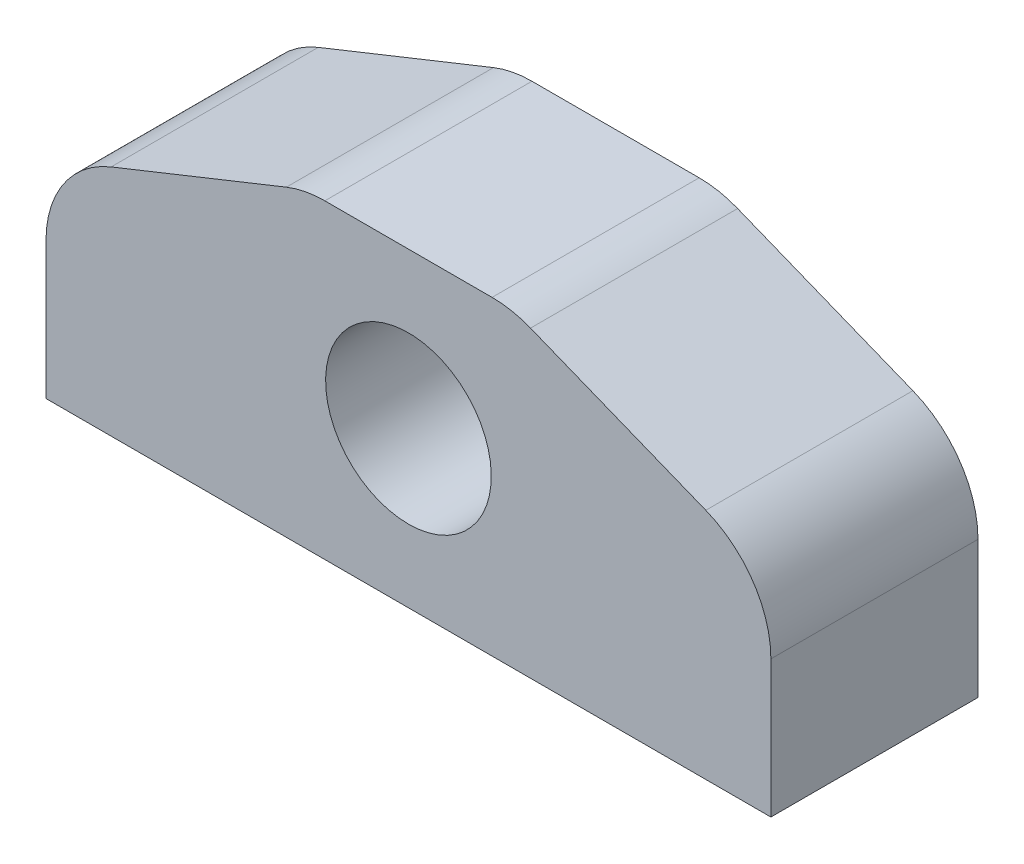
ISO-10303-21;
HEADER;
FILE_DESCRIPTION(('STEP AP214'),'2;1');
FILE_NAME('part.step','',(''),(''),'','','');
FILE_SCHEMA(('AUTOMOTIVE_DESIGN { 1 0 10303 214 1 1 1 1 }'));
ENDSEC;
DATA;
#1=APPLICATION_CONTEXT('core data for automotive mechanical design processes');
#2=APPLICATION_PROTOCOL_DEFINITION('international standard','automotive_design',2000,#1);
#3=PRODUCT_CONTEXT('',#1,'mechanical');
#4=PRODUCT('Part','Part','',(#3));
#5=PRODUCT_RELATED_PRODUCT_CATEGORY('part','',(#4));
#6=PRODUCT_DEFINITION_FORMATION('','',#4);
#7=PRODUCT_DEFINITION_CONTEXT('part definition',#1,'design');
#8=PRODUCT_DEFINITION('design','',#6,#7);
#9=PRODUCT_DEFINITION_SHAPE('','',#8);
#10=(LENGTH_UNIT() NAMED_UNIT(*) SI_UNIT(.MILLI.,.METRE.));
#11=(NAMED_UNIT(*) PLANE_ANGLE_UNIT() SI_UNIT($,.RADIAN.));
#12=(NAMED_UNIT(*) SI_UNIT($,.STERADIAN.) SOLID_ANGLE_UNIT());
#13=UNCERTAINTY_MEASURE_WITH_UNIT(LENGTH_MEASURE(1.E-05),#10,'distance_accuracy_value','');
#14=(GEOMETRIC_REPRESENTATION_CONTEXT(3) GLOBAL_UNCERTAINTY_ASSIGNED_CONTEXT((#13)) GLOBAL_UNIT_ASSIGNED_CONTEXT((#10,
#11,#12)) REPRESENTATION_CONTEXT('',''));
#15=CARTESIAN_POINT('',(0.,0.,0.));
#16=DIRECTION('',(0.,0.,1.));
#17=DIRECTION('',(1.,0.,0.));
#18=AXIS2_PLACEMENT_3D('',#15,#16,#17);
#19=CARTESIAN_POINT('',(-25.,20.,0.));
#20=DIRECTION('',(0.,1.,0.));
#21=DIRECTION('',(0.,0.,1.));
#22=AXIS2_PLACEMENT_3D('',#19,#20,#21);
#23=PLANE('',#22);
#24=CARTESIAN_POINT('',(-25.,20.,0.));
#25=DIRECTION('',(0.,-1.,0.));
#26=DIRECTION('',(0.,0.,-1.));
#27=AXIS2_PLACEMENT_3D('',#24,#25,#26);
#28=CIRCLE('',#27,3.00000000000001);
#29=CARTESIAN_POINT('',(-25.,20.,-3.00000000000001));
#30=VERTEX_POINT('',#29);
#31=EDGE_CURVE('E20',#30,#30,#28,.T.);
#32=ORIENTED_EDGE('',*,*,#31,.T.);
#33=EDGE_LOOP('',(#32));
#34=FACE_BOUND('',#33,.T.);
#35=ADVANCED_FACE('F17',(#34),#23,.F.);
#36=CARTESIAN_POINT('',(25.,20.,0.));
#37=DIRECTION('',(0.,1.,0.));
#38=DIRECTION('',(0.,0.,1.));
#39=AXIS2_PLACEMENT_3D('',#36,#37,#38);
#40=PLANE('',#39);
#41=CARTESIAN_POINT('',(25.,20.,0.));
#42=DIRECTION('',(0.,-1.,0.));
#43=DIRECTION('',(0.,0.,-1.));
#44=AXIS2_PLACEMENT_3D('',#41,#42,#43);
#45=CIRCLE('',#44,3.00000000000001);
#46=CARTESIAN_POINT('',(25.,20.,-3.00000000000001));
#47=VERTEX_POINT('',#46);
#48=EDGE_CURVE('E189',#47,#47,#45,.T.);
#49=ORIENTED_EDGE('',*,*,#48,.T.);
#50=EDGE_LOOP('',(#49));
#51=FACE_BOUND('',#50,.T.);
#52=ADVANCED_FACE('F201',(#51),#40,.F.);
#53=CARTESIAN_POINT('',(-25.,0.,0.));
#54=DIRECTION('',(0.,-1.,0.));
#55=DIRECTION('',(0.,0.,-1.));
#56=AXIS2_PLACEMENT_3D('',#53,#54,#55);
#57=CYLINDRICAL_SURFACE('',#56,3.00000000000001);
#58=ORIENTED_EDGE('',*,*,#31,.F.);
#59=EDGE_LOOP('',(#58));
#60=FACE_BOUND('',#59,.T.);
#61=CARTESIAN_POINT('',(-25.,0.,0.));
#62=DIRECTION('',(0.,-1.,0.));
#63=DIRECTION('',(0.,0.,-1.));
#64=AXIS2_PLACEMENT_3D('',#61,#62,#63);
#65=CIRCLE('',#64,3.00000000000001);
#66=CARTESIAN_POINT('',(-25.,0.,-3.00000000000001));
#67=VERTEX_POINT('',#66);
#68=EDGE_CURVE('E146',#67,#67,#65,.T.);
#69=ORIENTED_EDGE('',*,*,#68,.T.);
#70=EDGE_LOOP('',(#69));
#71=FACE_BOUND('',#70,.T.);
#72=ADVANCED_FACE('F197',(#60,#71),#57,.F.);
#73=CARTESIAN_POINT('',(25.,0.,0.));
#74=DIRECTION('',(0.,-1.,0.));
#75=DIRECTION('',(0.,0.,-1.));
#76=AXIS2_PLACEMENT_3D('',#73,#74,#75);
#77=CYLINDRICAL_SURFACE('',#76,3.00000000000001);
#78=ORIENTED_EDGE('',*,*,#48,.F.);
#79=EDGE_LOOP('',(#78));
#80=FACE_BOUND('',#79,.T.);
#81=CARTESIAN_POINT('',(25.,0.,0.));
#82=DIRECTION('',(0.,-1.,0.));
#83=DIRECTION('',(0.,0.,-1.));
#84=AXIS2_PLACEMENT_3D('',#81,#82,#83);
#85=CIRCLE('',#84,3.00000000000001);
#86=CARTESIAN_POINT('',(25.,0.,-3.00000000000001));
#87=VERTEX_POINT('',#86);
#88=EDGE_CURVE('E136',#87,#87,#85,.T.);
#89=ORIENTED_EDGE('',*,*,#88,.T.);
#90=EDGE_LOOP('',(#89));
#91=FACE_BOUND('',#90,.T.);
#92=ADVANCED_FACE('F200',(#80,#91),#77,.F.);
#93=CARTESIAN_POINT('',(-25.,13.229670385731,-10.));
#94=DIRECTION('',(0.,0.,1.));
#95=DIRECTION('',(1.,0.,0.));
#96=AXIS2_PLACEMENT_3D('',#93,#94,#95);
#97=PLANE('',#96);
#98=CARTESIAN_POINT('',(1.1319417564923E-10,14.9999999996836,-9.99999999999995));
#99=DIRECTION('',(0.,0.,1.));
#100=DIRECTION('',(0.,-1.,0.));
#101=AXIS2_PLACEMENT_3D('',#98,#99,#100);
#102=CIRCLE('',#101,8.);
#103=CARTESIAN_POINT('',(1.1319417564923E-10,6.99999999968357,-9.99999999999994));
#104=VERTEX_POINT('',#103);
#105=EDGE_CURVE('E147',#104,#104,#102,.T.);
#106=ORIENTED_EDGE('',*,*,#105,.T.);
#107=EDGE_LOOP('',(#106));
#108=FACE_BOUND('',#107,.T.);
#109=CARTESIAN_POINT('',(-25.,13.229670385731,-10.));
#110=DIRECTION('',(0.,0.,-1.));
#111=DIRECTION('',(-1.,0.,0.));
#112=AXIS2_PLACEMENT_3D('',#109,#110,#111);
#113=CIRCLE('',#112,10.);
#114=CARTESIAN_POINT('',(-28.713906763541,22.5144372945836,-10.));
#115=VERTEX_POINT('',#114);
#116=CARTESIAN_POINT('',(-35.,13.229670385731,-10.));
#117=VERTEX_POINT('',#116);
#118=EDGE_CURVE('E142',#115,#117,#113,.F.);
#119=ORIENTED_EDGE('',*,*,#118,.F.);
#120=DIRECTION('',(0.928476690885259,0.371390676354104,0.));
#121=VECTOR('',#120,1.);
#122=CARTESIAN_POINT('',(-11.7880827278686,29.2847669088526,-10.));
#123=LINE('',#122,#121);
#124=CARTESIAN_POINT('',(-11.7880827278685,29.2847669088526,-10.));
#125=VERTEX_POINT('',#124);
#126=EDGE_CURVE('E139',#115,#125,#123,.T.);
#127=ORIENTED_EDGE('',*,*,#126,.T.);
#128=CARTESIAN_POINT('',(-8.07417596432748,20.,-10.));
#129=DIRECTION('',(0.,0.,-1.));
#130=DIRECTION('',(-1.,0.,0.));
#131=AXIS2_PLACEMENT_3D('',#128,#129,#130);
#132=CIRCLE('',#131,10.);
#133=CARTESIAN_POINT('',(-8.07417596432746,30.,-10.));
#134=VERTEX_POINT('',#133);
#135=EDGE_CURVE('E153',#134,#125,#132,.F.);
#136=ORIENTED_EDGE('',*,*,#135,.F.);
#137=DIRECTION('',(1.,0.,0.));
#138=VECTOR('',#137,1.);
#139=CARTESIAN_POINT('',(-8.07417596432744,30.,-10.));
#140=LINE('',#139,#138);
#141=CARTESIAN_POINT('',(8.07417596432746,30.,-10.));
#142=VERTEX_POINT('',#141);
#143=EDGE_CURVE('E150',#134,#142,#140,.T.);
#144=ORIENTED_EDGE('',*,*,#143,.T.);
#145=CARTESIAN_POINT('',(8.07417596432748,20.,-10.));
#146=DIRECTION('',(0.,0.,-1.));
#147=DIRECTION('',(-1.,0.,0.));
#148=AXIS2_PLACEMENT_3D('',#145,#146,#147);
#149=CIRCLE('',#148,10.);
#150=CARTESIAN_POINT('',(11.7880827278685,29.2847669088526,-10.));
#151=VERTEX_POINT('',#150);
#152=EDGE_CURVE('E157',#151,#142,#149,.F.);
#153=ORIENTED_EDGE('',*,*,#152,.F.);
#154=DIRECTION('',(0.928476690885259,-0.371390676354104,0.));
#155=VECTOR('',#154,1.);
#156=CARTESIAN_POINT('',(11.7880827278686,29.2847669088526,-10.));
#157=LINE('',#156,#155);
#158=CARTESIAN_POINT('',(28.713906763541,22.5144372945836,-10.));
#159=VERTEX_POINT('',#158);
#160=EDGE_CURVE('E155',#151,#159,#157,.T.);
#161=ORIENTED_EDGE('',*,*,#160,.T.);
#162=CARTESIAN_POINT('',(25.,13.229670385731,-10.));
#163=DIRECTION('',(0.,0.,-1.));
#164=DIRECTION('',(-1.,0.,0.));
#165=AXIS2_PLACEMENT_3D('',#162,#163,#164);
#166=CIRCLE('',#165,10.);
#167=CARTESIAN_POINT('',(35.,13.229670385731,-10.));
#168=VERTEX_POINT('',#167);
#169=EDGE_CURVE('E87',#168,#159,#166,.F.);
#170=ORIENTED_EDGE('',*,*,#169,.F.);
#171=DIRECTION('',(0.,1.,0.));
#172=VECTOR('',#171,1.);
#173=CARTESIAN_POINT('',(35.,0.,-10.));
#174=LINE('',#173,#172);
#175=CARTESIAN_POINT('',(35.,0.,-10.));
#176=VERTEX_POINT('',#175);
#177=EDGE_CURVE('E111',#168,#176,#174,.F.);
#178=ORIENTED_EDGE('',*,*,#177,.T.);
#179=DIRECTION('',(1.,0.,0.));
#180=VECTOR('',#179,1.);
#181=CARTESIAN_POINT('',(-35.,0.,-10.));
#182=LINE('',#181,#180);
#183=CARTESIAN_POINT('',(-35.,0.,-10.));
#184=VERTEX_POINT('',#183);
#185=EDGE_CURVE('E95',#176,#184,#182,.F.);
#186=ORIENTED_EDGE('',*,*,#185,.T.);
#187=DIRECTION('',(0.,1.,0.));
#188=VECTOR('',#187,1.);
#189=CARTESIAN_POINT('',(-35.,0.,-10.));
#190=LINE('',#189,#188);
#191=EDGE_CURVE('E144',#184,#117,#190,.T.);
#192=ORIENTED_EDGE('',*,*,#191,.T.);
#193=EDGE_LOOP('',(#119,#127,#136,#144,#153,#161,#170,#178,#186,#192));
#194=FACE_BOUND('',#193,.T.);
#195=ADVANCED_FACE('F273',(#108,#194),#97,.F.);
#196=CARTESIAN_POINT('',(1.13194180652396E-10,14.9999999996847,493.961816649767));
#197=DIRECTION('',(0.,0.,1.));
#198=DIRECTION('',(0.,-1.,0.));
#199=AXIS2_PLACEMENT_3D('',#196,#197,#198);
#200=CYLINDRICAL_SURFACE('',#199,8.);
#201=ORIENTED_EDGE('',*,*,#105,.F.);
#202=EDGE_LOOP('',(#201));
#203=FACE_BOUND('',#202,.T.);
#204=CARTESIAN_POINT('',(1.13194175847783E-10,14.9999999996836,10.));
#205=DIRECTION('',(0.,0.,1.));
#206=DIRECTION('',(0.,-1.,0.));
#207=AXIS2_PLACEMENT_3D('',#204,#205,#206);
#208=CIRCLE('',#207,8.);
#209=CARTESIAN_POINT('',(1.13194175847783E-10,6.99999999968361,10.));
#210=VERTEX_POINT('',#209);
#211=EDGE_CURVE('E128',#210,#210,#208,.F.);
#212=ORIENTED_EDGE('',*,*,#211,.F.);
#213=EDGE_LOOP('',(#212));
#214=FACE_BOUND('',#213,.T.);
#215=ADVANCED_FACE('F215',(#203,#214),#200,.F.);
#216=CARTESIAN_POINT('',(-35.,0.,10.));
#217=DIRECTION('',(1.,0.,0.));
#218=DIRECTION('',(0.,0.,-1.));
#219=AXIS2_PLACEMENT_3D('',#216,#217,#218);
#220=PLANE('',#219);
#221=DIRECTION('',(0.,0.,1.));
#222=VECTOR('',#221,1.);
#223=CARTESIAN_POINT('',(-35.,0.,10.));
#224=LINE('',#223,#222);
#225=CARTESIAN_POINT('',(-35.,0.,10.));
#226=VERTEX_POINT('',#225);
#227=EDGE_CURVE('E100',#184,#226,#224,.T.);
#228=ORIENTED_EDGE('',*,*,#227,.T.);
#229=DIRECTION('',(0.,1.,0.));
#230=VECTOR('',#229,1.);
#231=CARTESIAN_POINT('',(-35.,13.229670385731,10.));
#232=LINE('',#231,#230);
#233=CARTESIAN_POINT('',(-35.,13.229670385731,10.));
#234=VERTEX_POINT('',#233);
#235=EDGE_CURVE('E126',#234,#226,#232,.F.);
#236=ORIENTED_EDGE('',*,*,#235,.F.);
#237=DIRECTION('',(0.,0.,-1.));
#238=VECTOR('',#237,1.);
#239=CARTESIAN_POINT('',(-35.,13.229670385731,10.));
#240=LINE('',#239,#238);
#241=EDGE_CURVE('E178',#117,#234,#240,.F.);
#242=ORIENTED_EDGE('',*,*,#241,.F.);
#243=ORIENTED_EDGE('',*,*,#191,.F.);
#244=EDGE_LOOP('',(#228,#236,#242,#243));
#245=FACE_BOUND('',#244,.T.);
#246=ADVANCED_FACE('F206',(#245),#220,.F.);
#247=CARTESIAN_POINT('',(-35.,0.,10.));
#248=DIRECTION('',(0.,1.,0.));
#249=DIRECTION('',(0.,0.,1.));
#250=AXIS2_PLACEMENT_3D('',#247,#248,#249);
#251=PLANE('',#250);
#252=DIRECTION('',(0.,0.,1.));
#253=VECTOR('',#252,1.);
#254=CARTESIAN_POINT('',(35.,0.,10.));
#255=LINE('',#254,#253);
#256=CARTESIAN_POINT('',(35.,0.,10.));
#257=VERTEX_POINT('',#256);
#258=EDGE_CURVE('E103',#176,#257,#255,.T.);
#259=ORIENTED_EDGE('',*,*,#258,.T.);
#260=DIRECTION('',(1.,0.,0.));
#261=VECTOR('',#260,1.);
#262=CARTESIAN_POINT('',(-25.,0.,10.));
#263=LINE('',#262,#261);
#264=EDGE_CURVE('E108',#226,#257,#263,.T.);
#265=ORIENTED_EDGE('',*,*,#264,.F.);
#266=ORIENTED_EDGE('',*,*,#227,.F.);
#267=ORIENTED_EDGE('',*,*,#185,.F.);
#268=EDGE_LOOP('',(#259,#265,#266,#267));
#269=FACE_BOUND('',#268,.T.);
#270=ORIENTED_EDGE('',*,*,#88,.F.);
#271=EDGE_LOOP('',(#270));
#272=FACE_BOUND('',#271,.T.);
#273=ORIENTED_EDGE('',*,*,#68,.F.);
#274=EDGE_LOOP('',(#273));
#275=FACE_BOUND('',#274,.T.);
#276=ADVANCED_FACE('F105',(#269,#272,#275),#251,.F.);
#277=CARTESIAN_POINT('',(35.,0.,10.));
#278=DIRECTION('',(-1.,0.,0.));
#279=DIRECTION('',(0.,0.,1.));
#280=AXIS2_PLACEMENT_3D('',#277,#278,#279);
#281=PLANE('',#280);
#282=DIRECTION('',(0.,0.,-1.));
#283=VECTOR('',#282,1.);
#284=CARTESIAN_POINT('',(35.,13.2296703857309,10.));
#285=LINE('',#284,#283);
#286=CARTESIAN_POINT('',(35.,13.229670385731,10.));
#287=VERTEX_POINT('',#286);
#288=EDGE_CURVE('E117',#287,#168,#285,.T.);
#289=ORIENTED_EDGE('',*,*,#288,.F.);
#290=DIRECTION('',(0.,1.,0.));
#291=VECTOR('',#290,1.);
#292=CARTESIAN_POINT('',(35.,13.229670385731,10.));
#293=LINE('',#292,#291);
#294=EDGE_CURVE('E114',#257,#287,#293,.T.);
#295=ORIENTED_EDGE('',*,*,#294,.F.);
#296=ORIENTED_EDGE('',*,*,#258,.F.);
#297=ORIENTED_EDGE('',*,*,#177,.F.);
#298=EDGE_LOOP('',(#289,#295,#296,#297));
#299=FACE_BOUND('',#298,.T.);
#300=ADVANCED_FACE('F115',(#299),#281,.F.);
#301=CARTESIAN_POINT('',(25.,13.229670385731,10.));
#302=DIRECTION('',(0.,0.,-1.));
#303=DIRECTION('',(-1.,0.,0.));
#304=AXIS2_PLACEMENT_3D('',#301,#302,#303);
#305=CYLINDRICAL_SURFACE('',#304,10.);
#306=CARTESIAN_POINT('',(25.,13.229670385731,10.));
#307=DIRECTION('',(0.,0.,-1.));
#308=DIRECTION('',(-1.,0.,0.));
#309=AXIS2_PLACEMENT_3D('',#306,#307,#308);
#310=CIRCLE('',#309,10.);
#311=CARTESIAN_POINT('',(28.713906763541,22.5144372945836,10.));
#312=VERTEX_POINT('',#311);
#313=EDGE_CURVE('E121',#287,#312,#310,.F.);
#314=ORIENTED_EDGE('',*,*,#313,.F.);
#315=ORIENTED_EDGE('',*,*,#288,.T.);
#316=ORIENTED_EDGE('',*,*,#169,.T.);
#317=DIRECTION('',(0.,0.,1.));
#318=VECTOR('',#317,1.);
#319=CARTESIAN_POINT('',(28.713906763541,22.5144372945836,10.));
#320=LINE('',#319,#318);
#321=EDGE_CURVE('E158',#159,#312,#320,.T.);
#322=ORIENTED_EDGE('',*,*,#321,.T.);
#323=EDGE_LOOP('',(#314,#315,#316,#322));
#324=FACE_BOUND('',#323,.T.);
#325=ADVANCED_FACE('F213',(#324),#305,.T.);
#326=CARTESIAN_POINT('',(11.7880827278686,29.2847669088526,10.));
#327=DIRECTION('',(-0.371390676354104,-0.928476690885259,0.));
#328=DIRECTION('',(0.928476690885259,-0.371390676354104,0.));
#329=AXIS2_PLACEMENT_3D('',#326,#327,#328);
#330=PLANE('',#329);
#331=DIRECTION('',(0.,0.,-1.));
#332=VECTOR('',#331,1.);
#333=CARTESIAN_POINT('',(11.7880827278685,29.2847669088526,10.));
#334=LINE('',#333,#332);
#335=CARTESIAN_POINT('',(11.7880827278685,29.2847669088526,10.));
#336=VERTEX_POINT('',#335);
#337=EDGE_CURVE('E182',#336,#151,#334,.T.);
#338=ORIENTED_EDGE('',*,*,#337,.F.);
#339=DIRECTION('',(-0.928476690885259,0.371390676354104,0.));
#340=VECTOR('',#339,1.);
#341=CARTESIAN_POINT('',(28.713906763541,22.5144372945836,10.));
#342=LINE('',#341,#340);
#343=EDGE_CURVE('E172',#312,#336,#342,.T.);
#344=ORIENTED_EDGE('',*,*,#343,.F.);
#345=ORIENTED_EDGE('',*,*,#321,.F.);
#346=ORIENTED_EDGE('',*,*,#160,.F.);
#347=EDGE_LOOP('',(#338,#344,#345,#346));
#348=FACE_BOUND('',#347,.T.);
#349=ADVANCED_FACE('F240',(#348),#330,.F.);
#350=CARTESIAN_POINT('',(8.07417596432748,20.,10.));
#351=DIRECTION('',(0.,0.,-1.));
#352=DIRECTION('',(-1.,0.,0.));
#353=AXIS2_PLACEMENT_3D('',#350,#351,#352);
#354=CYLINDRICAL_SURFACE('',#353,10.);
#355=CARTESIAN_POINT('',(8.07417596432748,20.,10.));
#356=DIRECTION('',(0.,0.,-1.));
#357=DIRECTION('',(-1.,0.,0.));
#358=AXIS2_PLACEMENT_3D('',#355,#356,#357);
#359=CIRCLE('',#358,10.);
#360=CARTESIAN_POINT('',(8.07417596432746,30.,10.));
#361=VERTEX_POINT('',#360);
#362=EDGE_CURVE('E169',#336,#361,#359,.F.);
#363=ORIENTED_EDGE('',*,*,#362,.F.);
#364=ORIENTED_EDGE('',*,*,#337,.T.);
#365=ORIENTED_EDGE('',*,*,#152,.T.);
#366=DIRECTION('',(0.,0.,-1.));
#367=VECTOR('',#366,1.);
#368=CARTESIAN_POINT('',(8.07417596432744,30.,10.));
#369=LINE('',#368,#367);
#370=EDGE_CURVE('E154',#142,#361,#369,.F.);
#371=ORIENTED_EDGE('',*,*,#370,.T.);
#372=EDGE_LOOP('',(#363,#364,#365,#371));
#373=FACE_BOUND('',#372,.T.);
#374=ADVANCED_FACE('F236',(#373),#354,.T.);
#375=CARTESIAN_POINT('',(-8.07417596432744,30.,10.));
#376=DIRECTION('',(0.,-1.,0.));
#377=DIRECTION('',(0.,0.,-1.));
#378=AXIS2_PLACEMENT_3D('',#375,#376,#377);
#379=PLANE('',#378);
#380=DIRECTION('',(0.,0.,-1.));
#381=VECTOR('',#380,1.);
#382=CARTESIAN_POINT('',(-8.07417596432744,30.,10.));
#383=LINE('',#382,#381);
#384=CARTESIAN_POINT('',(-8.07417596432746,30.,10.));
#385=VERTEX_POINT('',#384);
#386=EDGE_CURVE('E180',#385,#134,#383,.T.);
#387=ORIENTED_EDGE('',*,*,#386,.F.);
#388=DIRECTION('',(1.,0.,0.));
#389=VECTOR('',#388,1.);
#390=CARTESIAN_POINT('',(-25.,30.,10.));
#391=LINE('',#390,#389);
#392=EDGE_CURVE('E168',#361,#385,#391,.F.);
#393=ORIENTED_EDGE('',*,*,#392,.F.);
#394=ORIENTED_EDGE('',*,*,#370,.F.);
#395=ORIENTED_EDGE('',*,*,#143,.F.);
#396=EDGE_LOOP('',(#387,#393,#394,#395));
#397=FACE_BOUND('',#396,.T.);
#398=ADVANCED_FACE('F232',(#397),#379,.F.);
#399=CARTESIAN_POINT('',(-8.07417596432748,20.,10.));
#400=DIRECTION('',(0.,0.,-1.));
#401=DIRECTION('',(-1.,0.,0.));
#402=AXIS2_PLACEMENT_3D('',#399,#400,#401);
#403=CYLINDRICAL_SURFACE('',#402,10.);
#404=CARTESIAN_POINT('',(-8.07417596432748,20.,10.));
#405=DIRECTION('',(0.,0.,-1.));
#406=DIRECTION('',(-1.,0.,0.));
#407=AXIS2_PLACEMENT_3D('',#404,#405,#406);
#408=CIRCLE('',#407,10.);
#409=CARTESIAN_POINT('',(-11.7880827278685,29.2847669088526,10.));
#410=VERTEX_POINT('',#409);
#411=EDGE_CURVE('E165',#385,#410,#408,.F.);
#412=ORIENTED_EDGE('',*,*,#411,.F.);
#413=ORIENTED_EDGE('',*,*,#386,.T.);
#414=ORIENTED_EDGE('',*,*,#135,.T.);
#415=DIRECTION('',(0.,0.,1.));
#416=VECTOR('',#415,1.);
#417=CARTESIAN_POINT('',(-11.7880827278686,29.2847669088526,10.));
#418=LINE('',#417,#416);
#419=EDGE_CURVE('E143',#125,#410,#418,.T.);
#420=ORIENTED_EDGE('',*,*,#419,.T.);
#421=EDGE_LOOP('',(#412,#413,#414,#420));
#422=FACE_BOUND('',#421,.T.);
#423=ADVANCED_FACE('F229',(#422),#403,.T.);
#424=CARTESIAN_POINT('',(-11.7880827278686,29.2847669088526,10.));
#425=DIRECTION('',(0.371390676354104,-0.928476690885259,0.));
#426=DIRECTION('',(0.928476690885259,0.371390676354104,0.));
#427=AXIS2_PLACEMENT_3D('',#424,#425,#426);
#428=PLANE('',#427);
#429=DIRECTION('',(0.,0.,-1.));
#430=VECTOR('',#429,1.);
#431=CARTESIAN_POINT('',(-28.713906763541,22.5144372945836,10.));
#432=LINE('',#431,#430);
#433=CARTESIAN_POINT('',(-28.713906763541,22.5144372945836,10.));
#434=VERTEX_POINT('',#433);
#435=EDGE_CURVE('E35',#434,#115,#432,.T.);
#436=ORIENTED_EDGE('',*,*,#435,.F.);
#437=DIRECTION('',(-0.928476690885259,-0.371390676354104,0.));
#438=VECTOR('',#437,1.);
#439=CARTESIAN_POINT('',(-11.7880827278686,29.2847669088526,10.));
#440=LINE('',#439,#438);
#441=EDGE_CURVE('E26',#410,#434,#440,.T.);
#442=ORIENTED_EDGE('',*,*,#441,.F.);
#443=ORIENTED_EDGE('',*,*,#419,.F.);
#444=ORIENTED_EDGE('',*,*,#126,.F.);
#445=EDGE_LOOP('',(#436,#442,#443,#444));
#446=FACE_BOUND('',#445,.T.);
#447=ADVANCED_FACE('F223',(#446),#428,.F.);
#448=CARTESIAN_POINT('',(-25.,13.229670385731,10.));
#449=DIRECTION('',(0.,0.,-1.));
#450=DIRECTION('',(-1.,0.,0.));
#451=AXIS2_PLACEMENT_3D('',#448,#449,#450);
#452=CYLINDRICAL_SURFACE('',#451,10.);
#453=CARTESIAN_POINT('',(-25.,13.229670385731,10.));
#454=DIRECTION('',(0.,0.,-1.));
#455=DIRECTION('',(-1.,0.,0.));
#456=AXIS2_PLACEMENT_3D('',#453,#454,#455);
#457=CIRCLE('',#456,10.);
#458=EDGE_CURVE('E11',#434,#234,#457,.F.);
#459=ORIENTED_EDGE('',*,*,#458,.F.);
#460=ORIENTED_EDGE('',*,*,#435,.T.);
#461=ORIENTED_EDGE('',*,*,#118,.T.);
#462=ORIENTED_EDGE('',*,*,#241,.T.);
#463=EDGE_LOOP('',(#459,#460,#461,#462));
#464=FACE_BOUND('',#463,.T.);
#465=ADVANCED_FACE('F218',(#464),#452,.T.);
#466=CARTESIAN_POINT('',(-25.,13.229670385731,10.));
#467=DIRECTION('',(0.,0.,1.));
#468=DIRECTION('',(1.,0.,0.));
#469=AXIS2_PLACEMENT_3D('',#466,#467,#468);
#470=PLANE('',#469);
#471=ORIENTED_EDGE('',*,*,#441,.T.);
#472=ORIENTED_EDGE('',*,*,#458,.T.);
#473=ORIENTED_EDGE('',*,*,#235,.T.);
#474=ORIENTED_EDGE('',*,*,#264,.T.);
#475=ORIENTED_EDGE('',*,*,#294,.T.);
#476=ORIENTED_EDGE('',*,*,#313,.T.);
#477=ORIENTED_EDGE('',*,*,#343,.T.);
#478=ORIENTED_EDGE('',*,*,#362,.T.);
#479=ORIENTED_EDGE('',*,*,#392,.T.);
#480=ORIENTED_EDGE('',*,*,#411,.T.);
#481=EDGE_LOOP('',(#471,#472,#473,#474,#475,#476,#477,#478,#479,#480));
#482=FACE_BOUND('',#481,.T.);
#483=ORIENTED_EDGE('',*,*,#211,.T.);
#484=EDGE_LOOP('',(#483));
#485=FACE_BOUND('',#484,.T.);
#486=ADVANCED_FACE('F124',(#482,#485),#470,.T.);
#487=CLOSED_SHELL('',(#35,#52,#72,#92,#195,#215,#246,#276,#300,#325,#349,#374,#398,#423,#447,
#465,#486));
#488=MANIFOLD_SOLID_BREP('B1',#487);
#489=ADVANCED_BREP_SHAPE_REPRESENTATION('',(#18,#488),#14);
#490=SHAPE_DEFINITION_REPRESENTATION(#9,#489);
ENDSEC;
END-ISO-10303-21;
